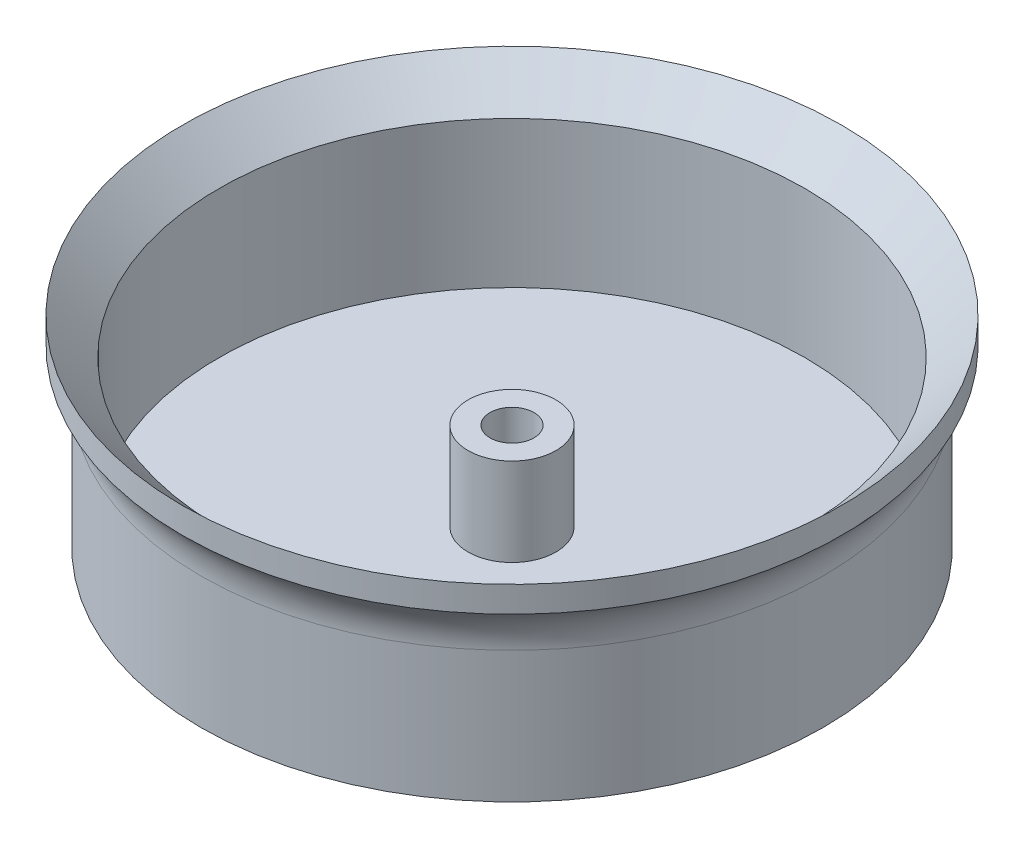
ISO-10303-21;
HEADER;
FILE_DESCRIPTION(('STEP AP214'),'2;1');
FILE_NAME('part.step','',(''),(''),'','','');
FILE_SCHEMA(('AUTOMOTIVE_DESIGN { 1 0 10303 214 1 1 1 1 }'));
ENDSEC;
DATA;
#1=APPLICATION_CONTEXT('core data for automotive mechanical design processes');
#2=APPLICATION_PROTOCOL_DEFINITION('international standard','automotive_design',2000,#1);
#3=PRODUCT_CONTEXT('',#1,'mechanical');
#4=PRODUCT('Part','Part','',(#3));
#5=PRODUCT_RELATED_PRODUCT_CATEGORY('part','',(#4));
#6=PRODUCT_DEFINITION_FORMATION('','',#4);
#7=PRODUCT_DEFINITION_CONTEXT('part definition',#1,'design');
#8=PRODUCT_DEFINITION('design','',#6,#7);
#9=PRODUCT_DEFINITION_SHAPE('','',#8);
#10=(LENGTH_UNIT() NAMED_UNIT(*) SI_UNIT(.MILLI.,.METRE.));
#11=(NAMED_UNIT(*) PLANE_ANGLE_UNIT() SI_UNIT($,.RADIAN.));
#12=(NAMED_UNIT(*) SI_UNIT($,.STERADIAN.) SOLID_ANGLE_UNIT());
#13=UNCERTAINTY_MEASURE_WITH_UNIT(LENGTH_MEASURE(1.E-05),#10,'distance_accuracy_value','');
#14=(GEOMETRIC_REPRESENTATION_CONTEXT(3) GLOBAL_UNCERTAINTY_ASSIGNED_CONTEXT((#13)) GLOBAL_UNIT_ASSIGNED_CONTEXT((#10,
#11,#12)) REPRESENTATION_CONTEXT('',''));
#15=CARTESIAN_POINT('',(0.,0.,0.));
#16=DIRECTION('',(0.,0.,1.));
#17=DIRECTION('',(1.,0.,0.));
#18=AXIS2_PLACEMENT_3D('',#15,#16,#17);
#19=CARTESIAN_POINT('',(0.,0.,0.));
#20=DIRECTION('',(0.,1.,0.));
#21=DIRECTION('',(0.,0.,1.));
#22=AXIS2_PLACEMENT_3D('',#19,#20,#21);
#23=CYLINDRICAL_SURFACE('',#22,3.81);
#24=CARTESIAN_POINT('',(0.,9.2075,0.));
#25=DIRECTION('',(0.,1.,0.));
#26=DIRECTION('',(0.,0.,1.));
#27=AXIS2_PLACEMENT_3D('',#24,#25,#26);
#28=CIRCLE('',#27,3.81);
#29=CARTESIAN_POINT('',(0.,9.2075,3.81));
#30=VERTEX_POINT('',#29);
#31=EDGE_CURVE('E10',#30,#30,#28,.T.);
#32=ORIENTED_EDGE('',*,*,#31,.F.);
#33=EDGE_LOOP('',(#32));
#34=FACE_BOUND('',#33,.T.);
#35=CARTESIAN_POINT('',(0.,1.5875,0.));
#36=DIRECTION('',(0.,1.,0.));
#37=DIRECTION('',(0.,0.,1.));
#38=AXIS2_PLACEMENT_3D('',#35,#36,#37);
#39=CIRCLE('',#38,3.81);
#40=CARTESIAN_POINT('',(0.,1.5875,3.81));
#41=VERTEX_POINT('',#40);
#42=EDGE_CURVE('E69',#41,#41,#39,.T.);
#43=ORIENTED_EDGE('',*,*,#42,.T.);
#44=EDGE_LOOP('',(#43));
#45=FACE_BOUND('',#44,.T.);
#46=ADVANCED_FACE('F35',(#34,#45),#23,.T.);
#47=CARTESIAN_POINT('',(0.,9.2075,-1.905));
#48=DIRECTION('',(0.,-1.,0.));
#49=DIRECTION('',(0.,0.,-1.));
#50=AXIS2_PLACEMENT_3D('',#47,#48,#49);
#51=PLANE('',#50);
#52=CARTESIAN_POINT('',(0.,9.2075,0.));
#53=DIRECTION('',(0.,1.,0.));
#54=DIRECTION('',(0.,0.,1.));
#55=AXIS2_PLACEMENT_3D('',#52,#53,#54);
#56=CIRCLE('',#55,1.905);
#57=CARTESIAN_POINT('',(0.,9.2075,1.905));
#58=VERTEX_POINT('',#57);
#59=EDGE_CURVE('E41',#58,#58,#56,.T.);
#60=ORIENTED_EDGE('',*,*,#59,.F.);
#61=EDGE_LOOP('',(#60));
#62=FACE_BOUND('',#61,.T.);
#63=ORIENTED_EDGE('',*,*,#31,.T.);
#64=EDGE_LOOP('',(#63));
#65=FACE_BOUND('',#64,.T.);
#66=ADVANCED_FACE('F118',(#62,#65),#51,.F.);
#67=CARTESIAN_POINT('',(0.,0.,0.));
#68=DIRECTION('',(0.,1.,0.));
#69=DIRECTION('',(0.,0.,1.));
#70=AXIS2_PLACEMENT_3D('',#67,#68,#69);
#71=CYLINDRICAL_SURFACE('',#70,1.905);
#72=CARTESIAN_POINT('',(0.,0.,0.));
#73=DIRECTION('',(0.,1.,0.));
#74=DIRECTION('',(0.,0.,1.));
#75=AXIS2_PLACEMENT_3D('',#72,#73,#74);
#76=CIRCLE('',#75,1.905);
#77=CARTESIAN_POINT('',(0.,0.,1.905));
#78=VERTEX_POINT('',#77);
#79=EDGE_CURVE('E45',#78,#78,#76,.T.);
#80=ORIENTED_EDGE('',*,*,#79,.F.);
#81=EDGE_LOOP('',(#80));
#82=FACE_BOUND('',#81,.T.);
#83=ORIENTED_EDGE('',*,*,#59,.T.);
#84=EDGE_LOOP('',(#83));
#85=FACE_BOUND('',#84,.T.);
#86=ADVANCED_FACE('F113',(#82,#85),#71,.F.);
#87=CARTESIAN_POINT('',(0.,0.,-26.9875));
#88=DIRECTION('',(0.,1.,0.));
#89=DIRECTION('',(0.,0.,1.));
#90=AXIS2_PLACEMENT_3D('',#87,#88,#89);
#91=PLANE('',#90);
#92=CARTESIAN_POINT('',(0.,0.,0.));
#93=DIRECTION('',(0.,1.,0.));
#94=DIRECTION('',(0.,0.,1.));
#95=AXIS2_PLACEMENT_3D('',#92,#93,#94);
#96=CIRCLE('',#95,26.9875);
#97=CARTESIAN_POINT('',(0.,0.,26.9875));
#98=VERTEX_POINT('',#97);
#99=EDGE_CURVE('E49',#98,#98,#96,.T.);
#100=ORIENTED_EDGE('',*,*,#99,.F.);
#101=EDGE_LOOP('',(#100));
#102=FACE_BOUND('',#101,.T.);
#103=ORIENTED_EDGE('',*,*,#79,.T.);
#104=EDGE_LOOP('',(#103));
#105=FACE_BOUND('',#104,.T.);
#106=ADVANCED_FACE('F107',(#102,#105),#91,.F.);
#107=CARTESIAN_POINT('',(0.,0.,0.));
#108=DIRECTION('',(0.,1.,0.));
#109=DIRECTION('',(0.,0.,1.));
#110=AXIS2_PLACEMENT_3D('',#107,#108,#109);
#111=CYLINDRICAL_SURFACE('',#110,26.9875);
#112=CARTESIAN_POINT('',(0.,11.3848719394654,0.));
#113=DIRECTION('',(0.,1.,0.));
#114=DIRECTION('',(0.,0.,1.));
#115=AXIS2_PLACEMENT_3D('',#112,#113,#114);
#116=CIRCLE('',#115,26.9875);
#117=CARTESIAN_POINT('',(0.,11.3848719394654,26.9875));
#118=VERTEX_POINT('',#117);
#119=EDGE_CURVE('E54',#118,#118,#116,.T.);
#120=ORIENTED_EDGE('',*,*,#119,.F.);
#121=EDGE_LOOP('',(#120));
#122=FACE_BOUND('',#121,.T.);
#123=ORIENTED_EDGE('',*,*,#99,.T.);
#124=EDGE_LOOP('',(#123));
#125=FACE_BOUND('',#124,.T.);
#126=ADVANCED_FACE('F101',(#122,#125),#111,.T.);
#127=CARTESIAN_POINT('',(0.,11.3848719394654,0.));
#128=DIRECTION('',(0.,1.,0.));
#129=DIRECTION('',(0.,0.,1.));
#130=AXIS2_PLACEMENT_3D('',#127,#128,#129);
#131=TOROIDAL_SURFACE('',#130,32.4075640302673,5.42006403026726);
#132=CARTESIAN_POINT('',(0.,15.2174359697327,0.));
#133=DIRECTION('',(0.,1.,0.));
#134=DIRECTION('',(0.,0.,1.));
#135=AXIS2_PLACEMENT_3D('',#132,#133,#134);
#136=CIRCLE('',#135,28.575);
#137=CARTESIAN_POINT('',(0.,15.2174359697327,28.575));
#138=VERTEX_POINT('',#137);
#139=EDGE_CURVE('E57',#138,#138,#136,.T.);
#140=ORIENTED_EDGE('',*,*,#139,.F.);
#141=EDGE_LOOP('',(#140));
#142=FACE_BOUND('',#141,.T.);
#143=ORIENTED_EDGE('',*,*,#119,.T.);
#144=EDGE_LOOP('',(#143));
#145=FACE_BOUND('',#144,.T.);
#146=ADVANCED_FACE('F95',(#142,#145),#131,.F.);
#147=CARTESIAN_POINT('',(0.,0.,0.));
#148=DIRECTION('',(0.,1.,0.));
#149=DIRECTION('',(0.,0.,1.));
#150=AXIS2_PLACEMENT_3D('',#147,#148,#149);
#151=CYLINDRICAL_SURFACE('',#150,28.575);
#152=CARTESIAN_POINT('',(0.,17.4625,0.));
#153=DIRECTION('',(0.,1.,0.));
#154=DIRECTION('',(0.,0.,1.));
#155=AXIS2_PLACEMENT_3D('',#152,#153,#154);
#156=CIRCLE('',#155,28.575);
#157=CARTESIAN_POINT('',(0.,17.4625,28.575));
#158=VERTEX_POINT('',#157);
#159=EDGE_CURVE('E60',#158,#158,#156,.T.);
#160=ORIENTED_EDGE('',*,*,#159,.F.);
#161=EDGE_LOOP('',(#160));
#162=FACE_BOUND('',#161,.T.);
#163=ORIENTED_EDGE('',*,*,#139,.T.);
#164=EDGE_LOOP('',(#163));
#165=FACE_BOUND('',#164,.T.);
#166=ADVANCED_FACE('F89',(#162,#165),#151,.T.);
#167=CARTESIAN_POINT('',(0.,17.4625,0.));
#168=DIRECTION('',(0.,1.,0.));
#169=DIRECTION('',(0.,0.,1.));
#170=AXIS2_PLACEMENT_3D('',#167,#168,#169);
#171=CONICAL_SURFACE('',#170,28.575,0.78539816339745);
#172=CARTESIAN_POINT('',(0.,14.2875,0.));
#173=DIRECTION('',(0.,1.,0.));
#174=DIRECTION('',(0.,0.,1.));
#175=AXIS2_PLACEMENT_3D('',#172,#173,#174);
#176=CIRCLE('',#175,25.4);
#177=CARTESIAN_POINT('',(0.,14.2875,25.4));
#178=VERTEX_POINT('',#177);
#179=EDGE_CURVE('E63',#178,#178,#176,.T.);
#180=ORIENTED_EDGE('',*,*,#179,.F.);
#181=EDGE_LOOP('',(#180));
#182=FACE_BOUND('',#181,.T.);
#183=ORIENTED_EDGE('',*,*,#159,.T.);
#184=EDGE_LOOP('',(#183));
#185=FACE_BOUND('',#184,.T.);
#186=ADVANCED_FACE('F83',(#182,#185),#171,.F.);
#187=CARTESIAN_POINT('',(0.,0.,0.));
#188=DIRECTION('',(0.,1.,0.));
#189=DIRECTION('',(0.,0.,1.));
#190=AXIS2_PLACEMENT_3D('',#187,#188,#189);
#191=CYLINDRICAL_SURFACE('',#190,25.4);
#192=CARTESIAN_POINT('',(0.,1.5875,0.));
#193=DIRECTION('',(0.,1.,0.));
#194=DIRECTION('',(0.,0.,1.));
#195=AXIS2_PLACEMENT_3D('',#192,#193,#194);
#196=CIRCLE('',#195,25.4);
#197=CARTESIAN_POINT('',(0.,1.5875,25.4));
#198=VERTEX_POINT('',#197);
#199=EDGE_CURVE('E66',#198,#198,#196,.T.);
#200=ORIENTED_EDGE('',*,*,#199,.F.);
#201=EDGE_LOOP('',(#200));
#202=FACE_BOUND('',#201,.T.);
#203=ORIENTED_EDGE('',*,*,#179,.T.);
#204=EDGE_LOOP('',(#203));
#205=FACE_BOUND('',#204,.T.);
#206=ADVANCED_FACE('F77',(#202,#205),#191,.F.);
#207=CARTESIAN_POINT('',(0.,1.5875,-3.81));
#208=DIRECTION('',(0.,-1.,0.));
#209=DIRECTION('',(0.,0.,-1.));
#210=AXIS2_PLACEMENT_3D('',#207,#208,#209);
#211=PLANE('',#210);
#212=ORIENTED_EDGE('',*,*,#42,.F.);
#213=EDGE_LOOP('',(#212));
#214=FACE_BOUND('',#213,.T.);
#215=ORIENTED_EDGE('',*,*,#199,.T.);
#216=EDGE_LOOP('',(#215));
#217=FACE_BOUND('',#216,.T.);
#218=ADVANCED_FACE('F74',(#214,#217),#211,.F.);
#219=CLOSED_SHELL('',(#46,#66,#86,#106,#126,#146,#166,#186,#206,#218));
#220=MANIFOLD_SOLID_BREP('B2',#219);
#221=ADVANCED_BREP_SHAPE_REPRESENTATION('',(#18,#220),#14);
#222=SHAPE_DEFINITION_REPRESENTATION(#9,#221);
ENDSEC;
END-ISO-10303-21;
